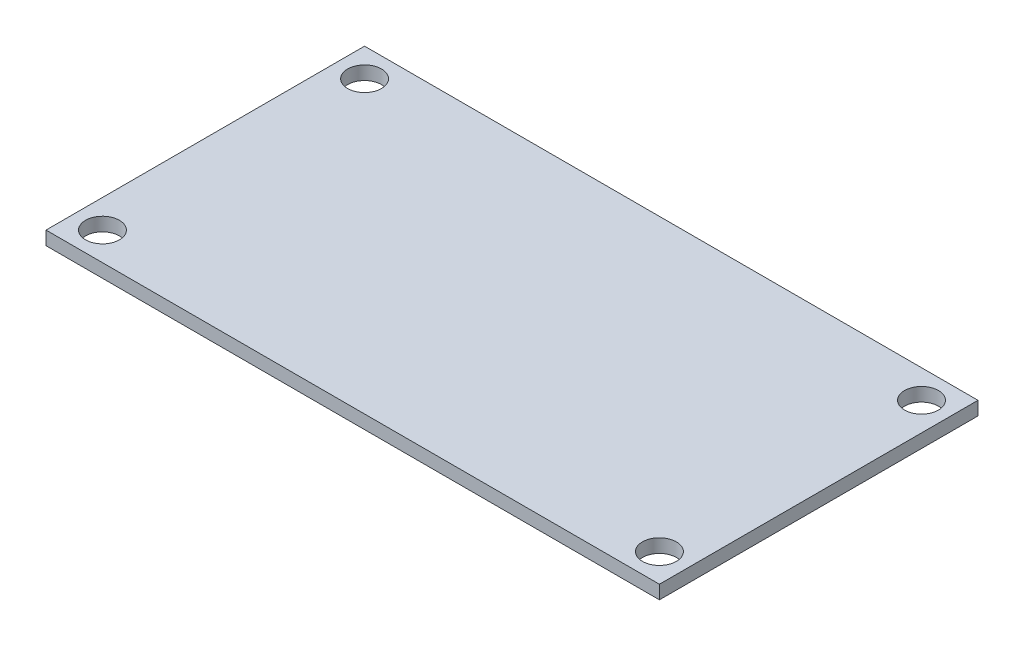
ISO-10303-21;
HEADER;
FILE_DESCRIPTION(('STEP AP214'),'2;1');
FILE_NAME('part.step','',(''),(''),'','','');
FILE_SCHEMA(('AUTOMOTIVE_DESIGN { 1 0 10303 214 1 1 1 1 }'));
ENDSEC;
DATA;
#1=APPLICATION_CONTEXT('core data for automotive mechanical design processes');
#2=APPLICATION_PROTOCOL_DEFINITION('international standard','automotive_design',2000,#1);
#3=PRODUCT_CONTEXT('',#1,'mechanical');
#4=PRODUCT('Part','Part','',(#3));
#5=PRODUCT_RELATED_PRODUCT_CATEGORY('part','',(#4));
#6=PRODUCT_DEFINITION_FORMATION('','',#4);
#7=PRODUCT_DEFINITION_CONTEXT('part definition',#1,'design');
#8=PRODUCT_DEFINITION('design','',#6,#7);
#9=PRODUCT_DEFINITION_SHAPE('','',#8);
#10=(LENGTH_UNIT() NAMED_UNIT(*) SI_UNIT(.MILLI.,.METRE.));
#11=(NAMED_UNIT(*) PLANE_ANGLE_UNIT() SI_UNIT($,.RADIAN.));
#12=(NAMED_UNIT(*) SI_UNIT($,.STERADIAN.) SOLID_ANGLE_UNIT());
#13=UNCERTAINTY_MEASURE_WITH_UNIT(LENGTH_MEASURE(1.E-05),#10,'distance_accuracy_value','');
#14=(GEOMETRIC_REPRESENTATION_CONTEXT(3) GLOBAL_UNCERTAINTY_ASSIGNED_CONTEXT((#13)) GLOBAL_UNIT_ASSIGNED_CONTEXT((#10,
#11,#12)) REPRESENTATION_CONTEXT('',''));
#15=CARTESIAN_POINT('',(0.,0.,0.));
#16=DIRECTION('',(0.,0.,1.));
#17=DIRECTION('',(1.,0.,0.));
#18=AXIS2_PLACEMENT_3D('',#15,#16,#17);
#19=CARTESIAN_POINT('',(-27.15,1.2,-14.1));
#20=DIRECTION('',(1.,0.,0.));
#21=DIRECTION('',(0.,0.,-1.));
#22=AXIS2_PLACEMENT_3D('',#19,#20,#21);
#23=PLANE('',#22);
#24=DIRECTION('',(0.,0.,1.));
#25=VECTOR('',#24,1.);
#26=CARTESIAN_POINT('',(-27.15,0.,-14.1));
#27=LINE('',#26,#25);
#28=CARTESIAN_POINT('',(-27.15,0.,-14.1));
#29=VERTEX_POINT('',#28);
#30=CARTESIAN_POINT('',(-27.15,0.,14.1));
#31=VERTEX_POINT('',#30);
#32=EDGE_CURVE('E96',#29,#31,#27,.T.);
#33=ORIENTED_EDGE('',*,*,#32,.T.);
#34=DIRECTION('',(0.,-1.,0.));
#35=VECTOR('',#34,1.);
#36=CARTESIAN_POINT('',(-27.15,1.2,14.1));
#37=LINE('',#36,#35);
#38=CARTESIAN_POINT('',(-27.15,1.2,14.1));
#39=VERTEX_POINT('',#38);
#40=EDGE_CURVE('E11',#39,#31,#37,.T.);
#41=ORIENTED_EDGE('',*,*,#40,.F.);
#42=DIRECTION('',(0.,0.,1.));
#43=VECTOR('',#42,1.);
#44=CARTESIAN_POINT('',(-27.15,1.2,-14.1));
#45=LINE('',#44,#43);
#46=CARTESIAN_POINT('',(-27.15,1.2,-14.1));
#47=VERTEX_POINT('',#46);
#48=EDGE_CURVE('E84',#47,#39,#45,.T.);
#49=ORIENTED_EDGE('',*,*,#48,.F.);
#50=DIRECTION('',(0.,-1.,0.));
#51=VECTOR('',#50,1.);
#52=CARTESIAN_POINT('',(-27.15,1.2,-14.1));
#53=LINE('',#52,#51);
#54=EDGE_CURVE('E92',#47,#29,#53,.T.);
#55=ORIENTED_EDGE('',*,*,#54,.T.);
#56=EDGE_LOOP('',(#33,#41,#49,#55));
#57=FACE_BOUND('',#56,.T.);
#58=ADVANCED_FACE('F33',(#57),#23,.F.);
#59=CARTESIAN_POINT('',(27.15,1.2,14.1));
#60=DIRECTION('',(0.,0.,-1.));
#61=DIRECTION('',(-1.,0.,0.));
#62=AXIS2_PLACEMENT_3D('',#59,#60,#61);
#63=PLANE('',#62);
#64=DIRECTION('',(1.,0.,0.));
#65=VECTOR('',#64,1.);
#66=CARTESIAN_POINT('',(27.15,0.,14.1));
#67=LINE('',#66,#65);
#68=CARTESIAN_POINT('',(27.15,0.,14.1));
#69=VERTEX_POINT('',#68);
#70=EDGE_CURVE('E88',#31,#69,#67,.T.);
#71=ORIENTED_EDGE('',*,*,#70,.T.);
#72=DIRECTION('',(0.,-1.,0.));
#73=VECTOR('',#72,1.);
#74=CARTESIAN_POINT('',(27.15,1.2,14.1));
#75=LINE('',#74,#73);
#76=CARTESIAN_POINT('',(27.15,1.2,14.1));
#77=VERTEX_POINT('',#76);
#78=EDGE_CURVE('E41',#77,#69,#75,.T.);
#79=ORIENTED_EDGE('',*,*,#78,.F.);
#80=DIRECTION('',(1.,0.,0.));
#81=VECTOR('',#80,1.);
#82=CARTESIAN_POINT('',(27.15,1.2,14.1));
#83=LINE('',#82,#81);
#84=EDGE_CURVE('E79',#39,#77,#83,.T.);
#85=ORIENTED_EDGE('',*,*,#84,.F.);
#86=ORIENTED_EDGE('',*,*,#40,.T.);
#87=EDGE_LOOP('',(#71,#79,#85,#86));
#88=FACE_BOUND('',#87,.T.);
#89=ADVANCED_FACE('F87',(#88),#63,.F.);
#90=CARTESIAN_POINT('',(27.15,1.2,-14.1));
#91=DIRECTION('',(-1.,0.,0.));
#92=DIRECTION('',(0.,0.,1.));
#93=AXIS2_PLACEMENT_3D('',#90,#91,#92);
#94=PLANE('',#93);
#95=DIRECTION('',(0.,0.,-1.));
#96=VECTOR('',#95,1.);
#97=CARTESIAN_POINT('',(27.15,0.,-14.1));
#98=LINE('',#97,#96);
#99=CARTESIAN_POINT('',(27.15,0.,-14.1));
#100=VERTEX_POINT('',#99);
#101=EDGE_CURVE('E66',#69,#100,#98,.T.);
#102=ORIENTED_EDGE('',*,*,#101,.T.);
#103=DIRECTION('',(0.,-1.,0.));
#104=VECTOR('',#103,1.);
#105=CARTESIAN_POINT('',(27.15,1.2,-14.1));
#106=LINE('',#105,#104);
#107=CARTESIAN_POINT('',(27.15,1.2,-14.1));
#108=VERTEX_POINT('',#107);
#109=EDGE_CURVE('E89',#108,#100,#106,.T.);
#110=ORIENTED_EDGE('',*,*,#109,.F.);
#111=DIRECTION('',(0.,0.,-1.));
#112=VECTOR('',#111,1.);
#113=CARTESIAN_POINT('',(27.15,1.2,-14.1));
#114=LINE('',#113,#112);
#115=EDGE_CURVE('E82',#77,#108,#114,.T.);
#116=ORIENTED_EDGE('',*,*,#115,.F.);
#117=ORIENTED_EDGE('',*,*,#78,.T.);
#118=EDGE_LOOP('',(#102,#110,#116,#117));
#119=FACE_BOUND('',#118,.T.);
#120=ADVANCED_FACE('F90',(#119),#94,.F.);
#121=CARTESIAN_POINT('',(27.15,1.2,-14.1));
#122=DIRECTION('',(0.,0.,1.));
#123=DIRECTION('',(1.,0.,0.));
#124=AXIS2_PLACEMENT_3D('',#121,#122,#123);
#125=PLANE('',#124);
#126=DIRECTION('',(-1.,0.,0.));
#127=VECTOR('',#126,1.);
#128=CARTESIAN_POINT('',(27.15,0.,-14.1));
#129=LINE('',#128,#127);
#130=EDGE_CURVE('E72',#100,#29,#129,.T.);
#131=ORIENTED_EDGE('',*,*,#130,.T.);
#132=ORIENTED_EDGE('',*,*,#54,.F.);
#133=DIRECTION('',(-1.,0.,0.));
#134=VECTOR('',#133,1.);
#135=CARTESIAN_POINT('',(27.15,1.2,-14.1));
#136=LINE('',#135,#134);
#137=EDGE_CURVE('E49',#108,#47,#136,.T.);
#138=ORIENTED_EDGE('',*,*,#137,.F.);
#139=ORIENTED_EDGE('',*,*,#109,.T.);
#140=EDGE_LOOP('',(#131,#132,#138,#139));
#141=FACE_BOUND('',#140,.T.);
#142=ADVANCED_FACE('F104',(#141),#125,.F.);
#143=CARTESIAN_POINT('',(0.,1.2,0.));
#144=DIRECTION('',(0.,-1.,0.));
#145=DIRECTION('',(0.,0.,-1.));
#146=AXIS2_PLACEMENT_3D('',#143,#144,#145);
#147=PLANE('',#146);
#148=CARTESIAN_POINT('',(-24.65,1.2,11.6));
#149=DIRECTION('',(0.,1.,0.));
#150=DIRECTION('',(0.,0.,-1.));
#151=AXIS2_PLACEMENT_3D('',#148,#149,#150);
#152=CIRCLE('',#151,1.5);
#153=CARTESIAN_POINT('',(-24.65,1.2,10.1));
#154=VERTEX_POINT('',#153);
#155=EDGE_CURVE('E128',#154,#154,#152,.T.);
#156=ORIENTED_EDGE('',*,*,#155,.F.);
#157=EDGE_LOOP('',(#156));
#158=FACE_BOUND('',#157,.T.);
#159=CARTESIAN_POINT('',(24.65,1.2,11.6));
#160=DIRECTION('',(0.,1.,0.));
#161=DIRECTION('',(0.,0.,1.));
#162=AXIS2_PLACEMENT_3D('',#159,#160,#161);
#163=CIRCLE('',#162,1.5);
#164=CARTESIAN_POINT('',(24.65,1.2,13.1));
#165=VERTEX_POINT('',#164);
#166=EDGE_CURVE('E122',#165,#165,#163,.T.);
#167=ORIENTED_EDGE('',*,*,#166,.F.);
#168=EDGE_LOOP('',(#167));
#169=FACE_BOUND('',#168,.T.);
#170=CARTESIAN_POINT('',(24.65,1.2,-11.6));
#171=DIRECTION('',(0.,1.,0.));
#172=DIRECTION('',(0.,0.,-1.));
#173=AXIS2_PLACEMENT_3D('',#170,#171,#172);
#174=CIRCLE('',#173,1.5);
#175=CARTESIAN_POINT('',(24.65,1.2,-13.1));
#176=VERTEX_POINT('',#175);
#177=EDGE_CURVE('E116',#176,#176,#174,.T.);
#178=ORIENTED_EDGE('',*,*,#177,.F.);
#179=EDGE_LOOP('',(#178));
#180=FACE_BOUND('',#179,.T.);
#181=CARTESIAN_POINT('',(-24.65,1.2,-11.6));
#182=DIRECTION('',(0.,1.,0.));
#183=DIRECTION('',(0.,0.,1.));
#184=AXIS2_PLACEMENT_3D('',#181,#182,#183);
#185=CIRCLE('',#184,1.5);
#186=CARTESIAN_POINT('',(-24.65,1.2,-10.1));
#187=VERTEX_POINT('',#186);
#188=EDGE_CURVE('E110',#187,#187,#185,.T.);
#189=ORIENTED_EDGE('',*,*,#188,.F.);
#190=EDGE_LOOP('',(#189));
#191=FACE_BOUND('',#190,.T.);
#192=ORIENTED_EDGE('',*,*,#48,.T.);
#193=ORIENTED_EDGE('',*,*,#84,.T.);
#194=ORIENTED_EDGE('',*,*,#115,.T.);
#195=ORIENTED_EDGE('',*,*,#137,.T.);
#196=EDGE_LOOP('',(#192,#193,#194,#195));
#197=FACE_BOUND('',#196,.T.);
#198=ADVANCED_FACE('F80',(#158,#169,#180,#191,#197),#147,.F.);
#199=CARTESIAN_POINT('',(0.,0.,0.));
#200=DIRECTION('',(0.,-1.,0.));
#201=DIRECTION('',(0.,0.,-1.));
#202=AXIS2_PLACEMENT_3D('',#199,#200,#201);
#203=PLANE('',#202);
#204=CARTESIAN_POINT('',(-24.65,0.,11.6));
#205=DIRECTION('',(0.,1.,0.));
#206=DIRECTION('',(0.,0.,-1.));
#207=AXIS2_PLACEMENT_3D('',#204,#205,#206);
#208=CIRCLE('',#207,1.5);
#209=CARTESIAN_POINT('',(-24.65,0.,10.1));
#210=VERTEX_POINT('',#209);
#211=EDGE_CURVE('E125',#210,#210,#208,.T.);
#212=ORIENTED_EDGE('',*,*,#211,.T.);
#213=EDGE_LOOP('',(#212));
#214=FACE_BOUND('',#213,.T.);
#215=CARTESIAN_POINT('',(24.65,0.,11.6));
#216=DIRECTION('',(0.,1.,0.));
#217=DIRECTION('',(0.,0.,1.));
#218=AXIS2_PLACEMENT_3D('',#215,#216,#217);
#219=CIRCLE('',#218,1.5);
#220=CARTESIAN_POINT('',(24.65,0.,13.1));
#221=VERTEX_POINT('',#220);
#222=EDGE_CURVE('E119',#221,#221,#219,.T.);
#223=ORIENTED_EDGE('',*,*,#222,.T.);
#224=EDGE_LOOP('',(#223));
#225=FACE_BOUND('',#224,.T.);
#226=CARTESIAN_POINT('',(24.65,0.,-11.6));
#227=DIRECTION('',(0.,1.,0.));
#228=DIRECTION('',(0.,0.,-1.));
#229=AXIS2_PLACEMENT_3D('',#226,#227,#228);
#230=CIRCLE('',#229,1.5);
#231=CARTESIAN_POINT('',(24.65,0.,-13.1));
#232=VERTEX_POINT('',#231);
#233=EDGE_CURVE('E113',#232,#232,#230,.T.);
#234=ORIENTED_EDGE('',*,*,#233,.T.);
#235=EDGE_LOOP('',(#234));
#236=FACE_BOUND('',#235,.T.);
#237=CARTESIAN_POINT('',(-24.65,0.,-11.6));
#238=DIRECTION('',(0.,1.,0.));
#239=DIRECTION('',(0.,0.,1.));
#240=AXIS2_PLACEMENT_3D('',#237,#238,#239);
#241=CIRCLE('',#240,1.5);
#242=CARTESIAN_POINT('',(-24.65,0.,-10.1));
#243=VERTEX_POINT('',#242);
#244=EDGE_CURVE('E99',#243,#243,#241,.T.);
#245=ORIENTED_EDGE('',*,*,#244,.T.);
#246=EDGE_LOOP('',(#245));
#247=FACE_BOUND('',#246,.T.);
#248=ORIENTED_EDGE('',*,*,#32,.F.);
#249=ORIENTED_EDGE('',*,*,#130,.F.);
#250=ORIENTED_EDGE('',*,*,#101,.F.);
#251=ORIENTED_EDGE('',*,*,#70,.F.);
#252=EDGE_LOOP('',(#248,#249,#250,#251));
#253=FACE_BOUND('',#252,.T.);
#254=ADVANCED_FACE('F107',(#214,#225,#236,#247,#253),#203,.T.);
#255=CARTESIAN_POINT('',(-24.65,0.,-11.6));
#256=DIRECTION('',(0.,1.,0.));
#257=DIRECTION('',(0.,0.,1.));
#258=AXIS2_PLACEMENT_3D('',#255,#256,#257);
#259=CYLINDRICAL_SURFACE('',#258,1.5);
#260=ORIENTED_EDGE('',*,*,#244,.F.);
#261=EDGE_LOOP('',(#260));
#262=FACE_BOUND('',#261,.T.);
#263=ORIENTED_EDGE('',*,*,#188,.T.);
#264=EDGE_LOOP('',(#263));
#265=FACE_BOUND('',#264,.T.);
#266=ADVANCED_FACE('F152',(#262,#265),#259,.F.);
#267=CARTESIAN_POINT('',(24.65,0.,-11.6));
#268=DIRECTION('',(0.,1.,0.));
#269=DIRECTION('',(0.,0.,1.));
#270=AXIS2_PLACEMENT_3D('',#267,#268,#269);
#271=CYLINDRICAL_SURFACE('',#270,1.5);
#272=ORIENTED_EDGE('',*,*,#233,.F.);
#273=EDGE_LOOP('',(#272));
#274=FACE_BOUND('',#273,.T.);
#275=ORIENTED_EDGE('',*,*,#177,.T.);
#276=EDGE_LOOP('',(#275));
#277=FACE_BOUND('',#276,.T.);
#278=ADVANCED_FACE('F154',(#274,#277),#271,.F.);
#279=CARTESIAN_POINT('',(24.65,0.,11.6));
#280=DIRECTION('',(0.,1.,0.));
#281=DIRECTION('',(0.,0.,1.));
#282=AXIS2_PLACEMENT_3D('',#279,#280,#281);
#283=CYLINDRICAL_SURFACE('',#282,1.5);
#284=ORIENTED_EDGE('',*,*,#222,.F.);
#285=EDGE_LOOP('',(#284));
#286=FACE_BOUND('',#285,.T.);
#287=ORIENTED_EDGE('',*,*,#166,.T.);
#288=EDGE_LOOP('',(#287));
#289=FACE_BOUND('',#288,.T.);
#290=ADVANCED_FACE('F139',(#286,#289),#283,.F.);
#291=CARTESIAN_POINT('',(-24.65,0.,11.6));
#292=DIRECTION('',(0.,1.,0.));
#293=DIRECTION('',(0.,0.,1.));
#294=AXIS2_PLACEMENT_3D('',#291,#292,#293);
#295=CYLINDRICAL_SURFACE('',#294,1.5);
#296=ORIENTED_EDGE('',*,*,#211,.F.);
#297=EDGE_LOOP('',(#296));
#298=FACE_BOUND('',#297,.T.);
#299=ORIENTED_EDGE('',*,*,#155,.T.);
#300=EDGE_LOOP('',(#299));
#301=FACE_BOUND('',#300,.T.);
#302=ADVANCED_FACE('F136',(#298,#301),#295,.F.);
#303=CLOSED_SHELL('',(#58,#89,#120,#142,#198,#254,#266,#278,#290,#302));
#304=MANIFOLD_SOLID_BREP('B2',#303);
#305=ADVANCED_BREP_SHAPE_REPRESENTATION('',(#18,#304),#14);
#306=SHAPE_DEFINITION_REPRESENTATION(#9,#305);
ENDSEC;
END-ISO-10303-21;
